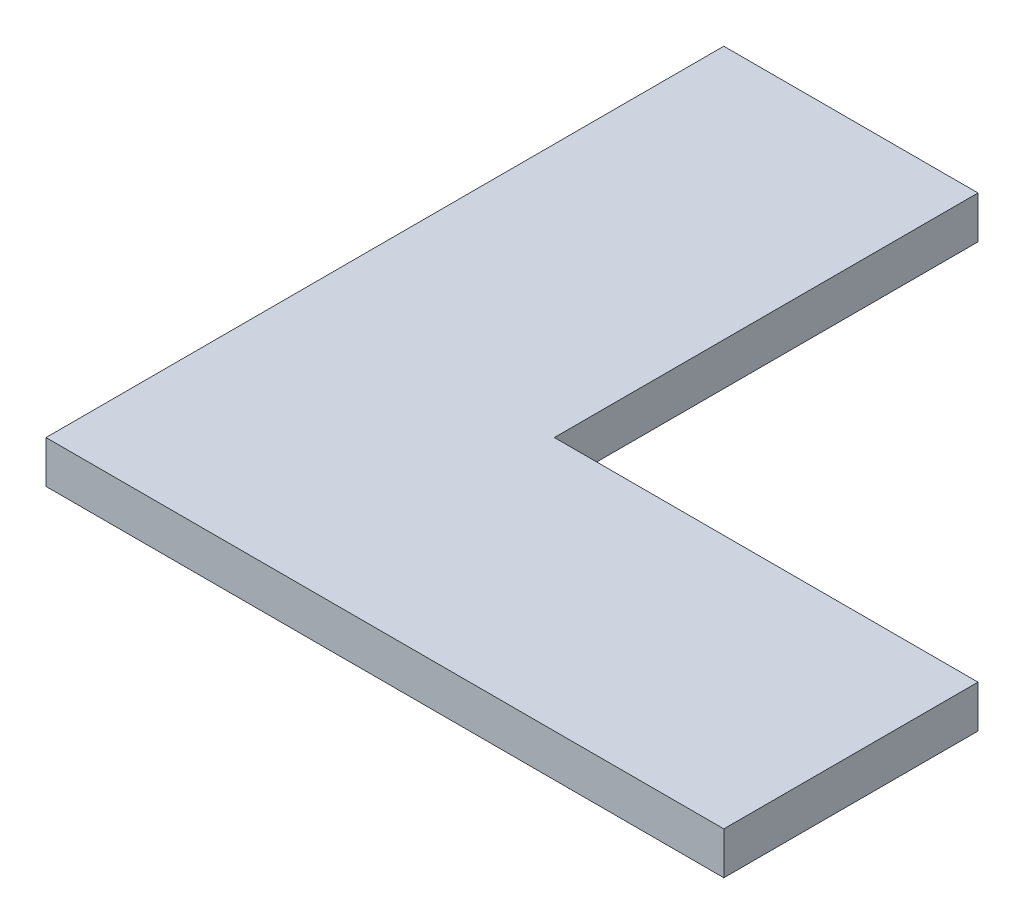
ISO-10303-21;
HEADER;
FILE_DESCRIPTION(('STEP AP214'),'2;1');
FILE_NAME('part.step','',(''),(''),'','','');
FILE_SCHEMA(('AUTOMOTIVE_DESIGN { 1 0 10303 214 1 1 1 1 }'));
ENDSEC;
DATA;
#1=APPLICATION_CONTEXT('core data for automotive mechanical design processes');
#2=APPLICATION_PROTOCOL_DEFINITION('international standard','automotive_design',2000,#1);
#3=PRODUCT_CONTEXT('',#1,'mechanical');
#4=PRODUCT('Part','Part','',(#3));
#5=PRODUCT_RELATED_PRODUCT_CATEGORY('part','',(#4));
#6=PRODUCT_DEFINITION_FORMATION('','',#4);
#7=PRODUCT_DEFINITION_CONTEXT('part definition',#1,'design');
#8=PRODUCT_DEFINITION('design','',#6,#7);
#9=PRODUCT_DEFINITION_SHAPE('','',#8);
#10=(LENGTH_UNIT() NAMED_UNIT(*) SI_UNIT(.MILLI.,.METRE.));
#11=(NAMED_UNIT(*) PLANE_ANGLE_UNIT() SI_UNIT($,.RADIAN.));
#12=(NAMED_UNIT(*) SI_UNIT($,.STERADIAN.) SOLID_ANGLE_UNIT());
#13=UNCERTAINTY_MEASURE_WITH_UNIT(LENGTH_MEASURE(1.E-05),#10,'distance_accuracy_value','');
#14=(GEOMETRIC_REPRESENTATION_CONTEXT(3) GLOBAL_UNCERTAINTY_ASSIGNED_CONTEXT((#13)) GLOBAL_UNIT_ASSIGNED_CONTEXT((#10,
#11,#12)) REPRESENTATION_CONTEXT('',''));
#15=CARTESIAN_POINT('',(0.,0.,0.));
#16=DIRECTION('',(0.,0.,1.));
#17=DIRECTION('',(1.,0.,0.));
#18=AXIS2_PLACEMENT_3D('',#15,#16,#17);
#19=CARTESIAN_POINT('',(-10.,2.5,-40.));
#20=DIRECTION('',(0.,0.,1.));
#21=DIRECTION('',(1.,0.,0.));
#22=AXIS2_PLACEMENT_3D('',#19,#20,#21);
#23=PLANE('',#22);
#24=DIRECTION('',(-1.,0.,0.));
#25=VECTOR('',#24,1.);
#26=CARTESIAN_POINT('',(-10.,-2.5,-40.));
#27=LINE('',#26,#25);
#28=CARTESIAN_POINT('',(-10.,-2.5,-40.));
#29=VERTEX_POINT('',#28);
#30=CARTESIAN_POINT('',(-40.,-2.5,-40.));
#31=VERTEX_POINT('',#30);
#32=EDGE_CURVE('E128',#29,#31,#27,.T.);
#33=ORIENTED_EDGE('',*,*,#32,.T.);
#34=DIRECTION('',(0.,-1.,0.));
#35=VECTOR('',#34,1.);
#36=CARTESIAN_POINT('',(-40.,2.5,-40.));
#37=LINE('',#36,#35);
#38=CARTESIAN_POINT('',(-40.,2.5,-40.));
#39=VERTEX_POINT('',#38);
#40=EDGE_CURVE('E11',#39,#31,#37,.T.);
#41=ORIENTED_EDGE('',*,*,#40,.F.);
#42=DIRECTION('',(-1.,0.,0.));
#43=VECTOR('',#42,1.);
#44=CARTESIAN_POINT('',(-10.,2.5,-40.));
#45=LINE('',#44,#43);
#46=CARTESIAN_POINT('',(-10.,2.5,-40.));
#47=VERTEX_POINT('',#46);
#48=EDGE_CURVE('E144',#47,#39,#45,.T.);
#49=ORIENTED_EDGE('',*,*,#48,.F.);
#50=DIRECTION('',(0.,-1.,0.));
#51=VECTOR('',#50,1.);
#52=CARTESIAN_POINT('',(-10.,2.5,-40.));
#53=LINE('',#52,#51);
#54=EDGE_CURVE('E124',#47,#29,#53,.T.);
#55=ORIENTED_EDGE('',*,*,#54,.T.);
#56=EDGE_LOOP('',(#33,#41,#49,#55));
#57=FACE_BOUND('',#56,.T.);
#58=ADVANCED_FACE('F39',(#57),#23,.F.);
#59=CARTESIAN_POINT('',(-40.,2.5,-40.));
#60=DIRECTION('',(1.,0.,0.));
#61=DIRECTION('',(0.,0.,-1.));
#62=AXIS2_PLACEMENT_3D('',#59,#60,#61);
#63=PLANE('',#62);
#64=DIRECTION('',(0.,0.,1.));
#65=VECTOR('',#64,1.);
#66=CARTESIAN_POINT('',(-40.,-2.5,-40.));
#67=LINE('',#66,#65);
#68=CARTESIAN_POINT('',(-40.,-2.5,40.));
#69=VERTEX_POINT('',#68);
#70=EDGE_CURVE('E132',#31,#69,#67,.T.);
#71=ORIENTED_EDGE('',*,*,#70,.T.);
#72=DIRECTION('',(0.,-1.,0.));
#73=VECTOR('',#72,1.);
#74=CARTESIAN_POINT('',(-40.,2.5,40.));
#75=LINE('',#74,#73);
#76=CARTESIAN_POINT('',(-40.,2.5,40.));
#77=VERTEX_POINT('',#76);
#78=EDGE_CURVE('E48',#77,#69,#75,.T.);
#79=ORIENTED_EDGE('',*,*,#78,.F.);
#80=DIRECTION('',(0.,0.,1.));
#81=VECTOR('',#80,1.);
#82=CARTESIAN_POINT('',(-40.,2.5,-40.));
#83=LINE('',#82,#81);
#84=EDGE_CURVE('E93',#39,#77,#83,.T.);
#85=ORIENTED_EDGE('',*,*,#84,.F.);
#86=ORIENTED_EDGE('',*,*,#40,.T.);
#87=EDGE_LOOP('',(#71,#79,#85,#86));
#88=FACE_BOUND('',#87,.T.);
#89=ADVANCED_FACE('F172',(#88),#63,.F.);
#90=CARTESIAN_POINT('',(-40.,2.5,40.));
#91=DIRECTION('',(0.,0.,-1.));
#92=DIRECTION('',(-1.,0.,0.));
#93=AXIS2_PLACEMENT_3D('',#90,#91,#92);
#94=PLANE('',#93);
#95=DIRECTION('',(1.,0.,0.));
#96=VECTOR('',#95,1.);
#97=CARTESIAN_POINT('',(-40.,-2.5,40.));
#98=LINE('',#97,#96);
#99=CARTESIAN_POINT('',(40.,-2.5,40.));
#100=VERTEX_POINT('',#99);
#101=EDGE_CURVE('E135',#69,#100,#98,.T.);
#102=ORIENTED_EDGE('',*,*,#101,.T.);
#103=DIRECTION('',(0.,-1.,0.));
#104=VECTOR('',#103,1.);
#105=CARTESIAN_POINT('',(40.,2.5,40.));
#106=LINE('',#105,#104);
#107=CARTESIAN_POINT('',(40.,2.5,40.));
#108=VERTEX_POINT('',#107);
#109=EDGE_CURVE('E117',#108,#100,#106,.T.);
#110=ORIENTED_EDGE('',*,*,#109,.F.);
#111=DIRECTION('',(1.,0.,0.));
#112=VECTOR('',#111,1.);
#113=CARTESIAN_POINT('',(-40.,2.5,40.));
#114=LINE('',#113,#112);
#115=EDGE_CURVE('E106',#77,#108,#114,.T.);
#116=ORIENTED_EDGE('',*,*,#115,.F.);
#117=ORIENTED_EDGE('',*,*,#78,.T.);
#118=EDGE_LOOP('',(#102,#110,#116,#117));
#119=FACE_BOUND('',#118,.T.);
#120=ADVANCED_FACE('F154',(#119),#94,.F.);
#121=CARTESIAN_POINT('',(40.,2.5,40.));
#122=DIRECTION('',(-1.,0.,0.));
#123=DIRECTION('',(0.,0.,1.));
#124=AXIS2_PLACEMENT_3D('',#121,#122,#123);
#125=PLANE('',#124);
#126=DIRECTION('',(0.,0.,-1.));
#127=VECTOR('',#126,1.);
#128=CARTESIAN_POINT('',(40.,-2.5,40.));
#129=LINE('',#128,#127);
#130=CARTESIAN_POINT('',(40.,-2.5,10.));
#131=VERTEX_POINT('',#130);
#132=EDGE_CURVE('E115',#100,#131,#129,.T.);
#133=ORIENTED_EDGE('',*,*,#132,.T.);
#134=DIRECTION('',(0.,-1.,0.));
#135=VECTOR('',#134,1.);
#136=CARTESIAN_POINT('',(40.,2.5,10.));
#137=LINE('',#136,#135);
#138=CARTESIAN_POINT('',(40.,2.5,10.));
#139=VERTEX_POINT('',#138);
#140=EDGE_CURVE('E112',#139,#131,#137,.T.);
#141=ORIENTED_EDGE('',*,*,#140,.F.);
#142=DIRECTION('',(0.,0.,-1.));
#143=VECTOR('',#142,1.);
#144=CARTESIAN_POINT('',(40.,2.5,40.));
#145=LINE('',#144,#143);
#146=EDGE_CURVE('E100',#108,#139,#145,.T.);
#147=ORIENTED_EDGE('',*,*,#146,.F.);
#148=ORIENTED_EDGE('',*,*,#109,.T.);
#149=EDGE_LOOP('',(#133,#141,#147,#148));
#150=FACE_BOUND('',#149,.T.);
#151=ADVANCED_FACE('F113',(#150),#125,.F.);
#152=CARTESIAN_POINT('',(40.,2.5,10.));
#153=DIRECTION('',(0.,0.,1.));
#154=DIRECTION('',(1.,0.,0.));
#155=AXIS2_PLACEMENT_3D('',#152,#153,#154);
#156=PLANE('',#155);
#157=DIRECTION('',(-1.,0.,0.));
#158=VECTOR('',#157,1.);
#159=CARTESIAN_POINT('',(40.,-2.5,10.));
#160=LINE('',#159,#158);
#161=CARTESIAN_POINT('',(-10.,-2.5,10.));
#162=VERTEX_POINT('',#161);
#163=EDGE_CURVE('E79',#131,#162,#160,.T.);
#164=ORIENTED_EDGE('',*,*,#163,.T.);
#165=DIRECTION('',(0.,-1.,0.));
#166=VECTOR('',#165,1.);
#167=CARTESIAN_POINT('',(-10.,2.5,10.));
#168=LINE('',#167,#166);
#169=CARTESIAN_POINT('',(-10.,2.5,10.));
#170=VERTEX_POINT('',#169);
#171=EDGE_CURVE('E118',#170,#162,#168,.T.);
#172=ORIENTED_EDGE('',*,*,#171,.F.);
#173=DIRECTION('',(-1.,0.,0.));
#174=VECTOR('',#173,1.);
#175=CARTESIAN_POINT('',(40.,2.5,10.));
#176=LINE('',#175,#174);
#177=EDGE_CURVE('E104',#139,#170,#176,.T.);
#178=ORIENTED_EDGE('',*,*,#177,.F.);
#179=ORIENTED_EDGE('',*,*,#140,.T.);
#180=EDGE_LOOP('',(#164,#172,#178,#179));
#181=FACE_BOUND('',#180,.T.);
#182=ADVANCED_FACE('F120',(#181),#156,.F.);
#183=CARTESIAN_POINT('',(-10.,2.5,10.));
#184=DIRECTION('',(-1.,0.,0.));
#185=DIRECTION('',(0.,0.,1.));
#186=AXIS2_PLACEMENT_3D('',#183,#184,#185);
#187=PLANE('',#186);
#188=DIRECTION('',(0.,0.,-1.));
#189=VECTOR('',#188,1.);
#190=CARTESIAN_POINT('',(-10.,-2.5,10.));
#191=LINE('',#190,#189);
#192=EDGE_CURVE('E85',#162,#29,#191,.T.);
#193=ORIENTED_EDGE('',*,*,#192,.T.);
#194=ORIENTED_EDGE('',*,*,#54,.F.);
#195=DIRECTION('',(0.,0.,-1.));
#196=VECTOR('',#195,1.);
#197=CARTESIAN_POINT('',(-10.,2.5,10.));
#198=LINE('',#197,#196);
#199=EDGE_CURVE('E56',#170,#47,#198,.T.);
#200=ORIENTED_EDGE('',*,*,#199,.F.);
#201=ORIENTED_EDGE('',*,*,#171,.T.);
#202=EDGE_LOOP('',(#193,#194,#200,#201));
#203=FACE_BOUND('',#202,.T.);
#204=ADVANCED_FACE('F161',(#203),#187,.F.);
#205=CARTESIAN_POINT('',(0.,2.5,0.));
#206=DIRECTION('',(0.,1.,0.));
#207=DIRECTION('',(0.,0.,1.));
#208=AXIS2_PLACEMENT_3D('',#205,#206,#207);
#209=PLANE('',#208);
#210=ORIENTED_EDGE('',*,*,#48,.T.);
#211=ORIENTED_EDGE('',*,*,#84,.T.);
#212=ORIENTED_EDGE('',*,*,#115,.T.);
#213=ORIENTED_EDGE('',*,*,#146,.T.);
#214=ORIENTED_EDGE('',*,*,#177,.T.);
#215=ORIENTED_EDGE('',*,*,#199,.T.);
#216=EDGE_LOOP('',(#210,#211,#212,#213,#214,#215));
#217=FACE_BOUND('',#216,.T.);
#218=ADVANCED_FACE('F102',(#217),#209,.T.);
#219=CARTESIAN_POINT('',(0.,-2.5,0.));
#220=DIRECTION('',(0.,1.,0.));
#221=DIRECTION('',(0.,0.,1.));
#222=AXIS2_PLACEMENT_3D('',#219,#220,#221);
#223=PLANE('',#222);
#224=ORIENTED_EDGE('',*,*,#32,.F.);
#225=ORIENTED_EDGE('',*,*,#192,.F.);
#226=ORIENTED_EDGE('',*,*,#163,.F.);
#227=ORIENTED_EDGE('',*,*,#132,.F.);
#228=ORIENTED_EDGE('',*,*,#101,.F.);
#229=ORIENTED_EDGE('',*,*,#70,.F.);
#230=EDGE_LOOP('',(#224,#225,#226,#227,#228,#229));
#231=FACE_BOUND('',#230,.T.);
#232=ADVANCED_FACE('F157',(#231),#223,.F.);
#233=CLOSED_SHELL('',(#58,#89,#120,#151,#182,#204,#218,#232));
#234=MANIFOLD_SOLID_BREP('B2',#233);
#235=ADVANCED_BREP_SHAPE_REPRESENTATION('',(#18,#234),#14);
#236=SHAPE_DEFINITION_REPRESENTATION(#9,#235);
ENDSEC;
END-ISO-10303-21;
